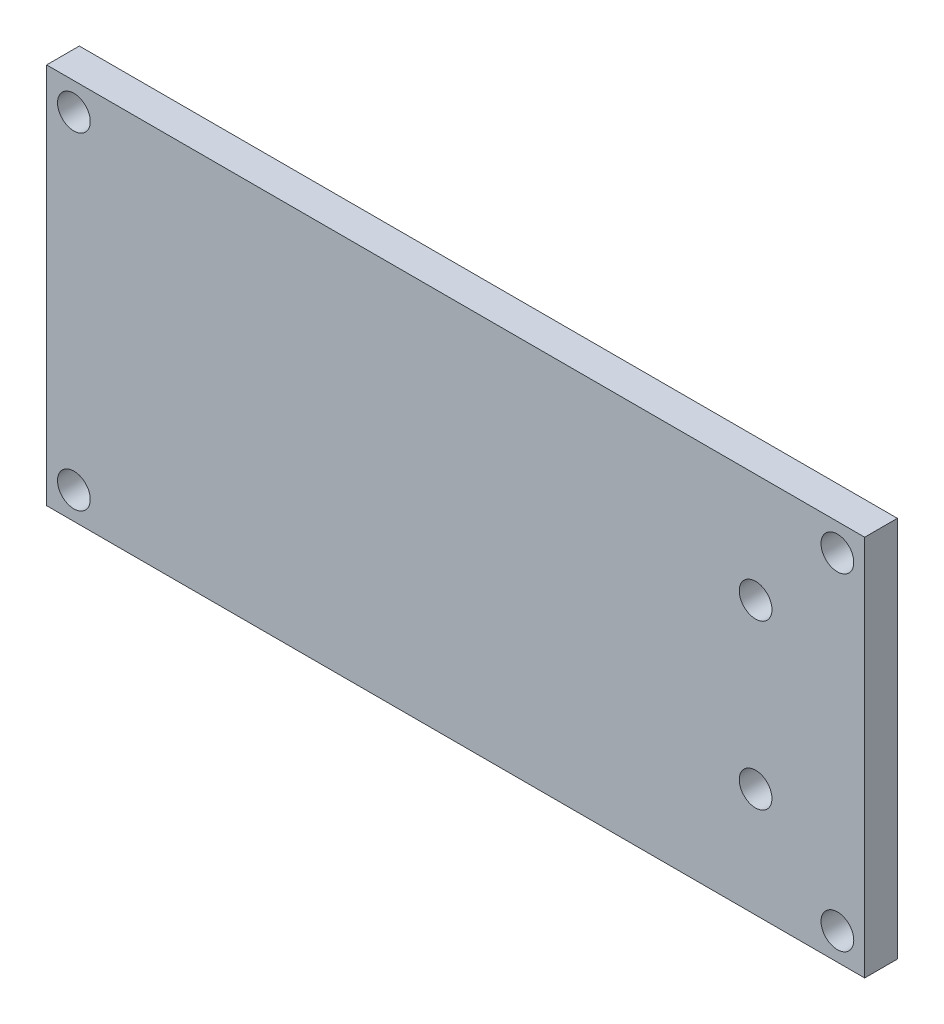
ISO-10303-21;
HEADER;
FILE_DESCRIPTION(('STEP AP214'),'2;1');
FILE_NAME('part.step','',(''),(''),'','','');
FILE_SCHEMA(('AUTOMOTIVE_DESIGN { 1 0 10303 214 1 1 1 1 }'));
ENDSEC;
DATA;
#1=APPLICATION_CONTEXT('core data for automotive mechanical design processes');
#2=APPLICATION_PROTOCOL_DEFINITION('international standard','automotive_design',2000,#1);
#3=PRODUCT_CONTEXT('',#1,'mechanical');
#4=PRODUCT('Part','Part','',(#3));
#5=PRODUCT_RELATED_PRODUCT_CATEGORY('part','',(#4));
#6=PRODUCT_DEFINITION_FORMATION('','',#4);
#7=PRODUCT_DEFINITION_CONTEXT('part definition',#1,'design');
#8=PRODUCT_DEFINITION('design','',#6,#7);
#9=PRODUCT_DEFINITION_SHAPE('','',#8);
#10=(LENGTH_UNIT() NAMED_UNIT(*) SI_UNIT(.MILLI.,.METRE.));
#11=(NAMED_UNIT(*) PLANE_ANGLE_UNIT() SI_UNIT($,.RADIAN.));
#12=(NAMED_UNIT(*) SI_UNIT($,.STERADIAN.) SOLID_ANGLE_UNIT());
#13=UNCERTAINTY_MEASURE_WITH_UNIT(LENGTH_MEASURE(1.E-05),#10,'distance_accuracy_value','');
#14=(GEOMETRIC_REPRESENTATION_CONTEXT(3) GLOBAL_UNCERTAINTY_ASSIGNED_CONTEXT((#13)) GLOBAL_UNIT_ASSIGNED_CONTEXT((#10,
#11,#12)) REPRESENTATION_CONTEXT('',''));
#15=CARTESIAN_POINT('',(0.,0.,0.));
#16=DIRECTION('',(0.,0.,1.));
#17=DIRECTION('',(1.,0.,0.));
#18=AXIS2_PLACEMENT_3D('',#15,#16,#17);
#19=CARTESIAN_POINT('',(0.,0.,3.));
#20=DIRECTION('',(0.,0.,-1.));
#21=DIRECTION('',(-1.,0.,0.));
#22=AXIS2_PLACEMENT_3D('',#19,#20,#21);
#23=PLANE('',#22);
#24=DIRECTION('',(0.,-1.,0.));
#25=VECTOR('',#24,1.);
#26=CARTESIAN_POINT('',(0.,0.,3.));
#27=LINE('',#26,#25);
#28=CARTESIAN_POINT('',(0.,35.,3.));
#29=VERTEX_POINT('',#28);
#30=CARTESIAN_POINT('',(0.,0.,3.));
#31=VERTEX_POINT('',#30);
#32=EDGE_CURVE('E98',#29,#31,#27,.T.);
#33=ORIENTED_EDGE('',*,*,#32,.T.);
#34=DIRECTION('',(1.,0.,0.));
#35=VECTOR('',#34,1.);
#36=CARTESIAN_POINT('',(0.,0.,3.));
#37=LINE('',#36,#35);
#38=CARTESIAN_POINT('',(75.,0.,3.));
#39=VERTEX_POINT('',#38);
#40=EDGE_CURVE('E93',#31,#39,#37,.T.);
#41=ORIENTED_EDGE('',*,*,#40,.T.);
#42=DIRECTION('',(0.,1.,0.));
#43=VECTOR('',#42,1.);
#44=CARTESIAN_POINT('',(75.,0.,3.));
#45=LINE('',#44,#43);
#46=CARTESIAN_POINT('',(75.,35.,3.));
#47=VERTEX_POINT('',#46);
#48=EDGE_CURVE('E96',#39,#47,#45,.T.);
#49=ORIENTED_EDGE('',*,*,#48,.T.);
#50=DIRECTION('',(-1.,0.,0.));
#51=VECTOR('',#50,1.);
#52=CARTESIAN_POINT('',(0.,35.,3.));
#53=LINE('',#52,#51);
#54=EDGE_CURVE('E63',#47,#29,#53,.T.);
#55=ORIENTED_EDGE('',*,*,#54,.T.);
#56=EDGE_LOOP('',(#33,#41,#49,#55));
#57=FACE_BOUND('',#56,.T.);
#58=CARTESIAN_POINT('',(2.5,32.5,3.));
#59=DIRECTION('',(0.,0.,1.));
#60=DIRECTION('',(1.,0.,0.));
#61=AXIS2_PLACEMENT_3D('',#58,#59,#60);
#62=CIRCLE('',#61,1.5);
#63=CARTESIAN_POINT('',(4.,32.5,3.));
#64=VERTEX_POINT('',#63);
#65=EDGE_CURVE('E118',#64,#64,#62,.T.);
#66=ORIENTED_EDGE('',*,*,#65,.F.);
#67=EDGE_LOOP('',(#66));
#68=FACE_BOUND('',#67,.T.);
#69=CARTESIAN_POINT('',(2.5,2.5,3.));
#70=DIRECTION('',(0.,0.,1.));
#71=DIRECTION('',(1.,0.,0.));
#72=AXIS2_PLACEMENT_3D('',#69,#70,#71);
#73=CIRCLE('',#72,1.5);
#74=CARTESIAN_POINT('',(4.,2.5,3.));
#75=VERTEX_POINT('',#74);
#76=EDGE_CURVE('E140',#75,#75,#73,.T.);
#77=ORIENTED_EDGE('',*,*,#76,.F.);
#78=EDGE_LOOP('',(#77));
#79=FACE_BOUND('',#78,.T.);
#80=CARTESIAN_POINT('',(72.5,2.5,3.));
#81=DIRECTION('',(0.,0.,1.));
#82=DIRECTION('',(1.,0.,0.));
#83=AXIS2_PLACEMENT_3D('',#80,#81,#82);
#84=CIRCLE('',#83,1.5);
#85=CARTESIAN_POINT('',(74.,2.5,3.));
#86=VERTEX_POINT('',#85);
#87=EDGE_CURVE('E148',#86,#86,#84,.T.);
#88=ORIENTED_EDGE('',*,*,#87,.F.);
#89=EDGE_LOOP('',(#88));
#90=FACE_BOUND('',#89,.T.);
#91=CARTESIAN_POINT('',(72.5,32.5,3.));
#92=DIRECTION('',(0.,0.,1.));
#93=DIRECTION('',(1.,0.,0.));
#94=AXIS2_PLACEMENT_3D('',#91,#92,#93);
#95=CIRCLE('',#94,1.5);
#96=CARTESIAN_POINT('',(74.,32.5,3.));
#97=VERTEX_POINT('',#96);
#98=EDGE_CURVE('E156',#97,#97,#95,.T.);
#99=ORIENTED_EDGE('',*,*,#98,.F.);
#100=EDGE_LOOP('',(#99));
#101=FACE_BOUND('',#100,.T.);
#102=CARTESIAN_POINT('',(65.,10.,3.));
#103=DIRECTION('',(0.,0.,1.));
#104=DIRECTION('',(1.,0.,0.));
#105=AXIS2_PLACEMENT_3D('',#102,#103,#104);
#106=CIRCLE('',#105,1.5);
#107=CARTESIAN_POINT('',(66.5,10.,3.));
#108=VERTEX_POINT('',#107);
#109=EDGE_CURVE('E164',#108,#108,#106,.T.);
#110=ORIENTED_EDGE('',*,*,#109,.F.);
#111=EDGE_LOOP('',(#110));
#112=FACE_BOUND('',#111,.T.);
#113=CARTESIAN_POINT('',(65.,25.,3.));
#114=DIRECTION('',(0.,0.,1.));
#115=DIRECTION('',(1.,0.,0.));
#116=AXIS2_PLACEMENT_3D('',#113,#114,#115);
#117=CIRCLE('',#116,1.5);
#118=CARTESIAN_POINT('',(66.5,25.,3.));
#119=VERTEX_POINT('',#118);
#120=EDGE_CURVE('E172',#119,#119,#117,.T.);
#121=ORIENTED_EDGE('',*,*,#120,.F.);
#122=EDGE_LOOP('',(#121));
#123=FACE_BOUND('',#122,.T.);
#124=ADVANCED_FACE('F45',(#57,#68,#79,#90,#101,#112,#123),#23,.F.);
#125=CARTESIAN_POINT('',(0.,0.,0.));
#126=DIRECTION('',(0.,0.,-1.));
#127=DIRECTION('',(-1.,0.,0.));
#128=AXIS2_PLACEMENT_3D('',#125,#126,#127);
#129=PLANE('',#128);
#130=CARTESIAN_POINT('',(65.,10.,0.));
#131=DIRECTION('',(0.,0.,1.));
#132=DIRECTION('',(1.,0.,0.));
#133=AXIS2_PLACEMENT_3D('',#130,#131,#132);
#134=CIRCLE('',#133,1.5);
#135=CARTESIAN_POINT('',(66.5,10.,0.));
#136=VERTEX_POINT('',#135);
#137=EDGE_CURVE('E168',#136,#136,#134,.T.);
#138=ORIENTED_EDGE('',*,*,#137,.T.);
#139=EDGE_LOOP('',(#138));
#140=FACE_BOUND('',#139,.T.);
#141=CARTESIAN_POINT('',(72.5,2.5,0.));
#142=DIRECTION('',(0.,0.,1.));
#143=DIRECTION('',(1.,0.,0.));
#144=AXIS2_PLACEMENT_3D('',#141,#142,#143);
#145=CIRCLE('',#144,1.5);
#146=CARTESIAN_POINT('',(74.,2.5,0.));
#147=VERTEX_POINT('',#146);
#148=EDGE_CURVE('E152',#147,#147,#145,.T.);
#149=ORIENTED_EDGE('',*,*,#148,.T.);
#150=EDGE_LOOP('',(#149));
#151=FACE_BOUND('',#150,.T.);
#152=CARTESIAN_POINT('',(2.5,32.5,0.));
#153=DIRECTION('',(0.,0.,1.));
#154=DIRECTION('',(1.,0.,0.));
#155=AXIS2_PLACEMENT_3D('',#152,#153,#154);
#156=CIRCLE('',#155,1.5);
#157=CARTESIAN_POINT('',(4.,32.5,0.));
#158=VERTEX_POINT('',#157);
#159=EDGE_CURVE('E136',#158,#158,#156,.T.);
#160=ORIENTED_EDGE('',*,*,#159,.T.);
#161=EDGE_LOOP('',(#160));
#162=FACE_BOUND('',#161,.T.);
#163=DIRECTION('',(0.,-1.,0.));
#164=VECTOR('',#163,1.);
#165=CARTESIAN_POINT('',(0.,0.,0.));
#166=LINE('',#165,#164);
#167=CARTESIAN_POINT('',(0.,35.,0.));
#168=VERTEX_POINT('',#167);
#169=CARTESIAN_POINT('',(0.,0.,0.));
#170=VERTEX_POINT('',#169);
#171=EDGE_CURVE('E114',#168,#170,#166,.T.);
#172=ORIENTED_EDGE('',*,*,#171,.F.);
#173=DIRECTION('',(-1.,0.,0.));
#174=VECTOR('',#173,1.);
#175=CARTESIAN_POINT('',(0.,35.,0.));
#176=LINE('',#175,#174);
#177=CARTESIAN_POINT('',(75.,35.,0.));
#178=VERTEX_POINT('',#177);
#179=EDGE_CURVE('E86',#178,#168,#176,.T.);
#180=ORIENTED_EDGE('',*,*,#179,.F.);
#181=DIRECTION('',(0.,1.,0.));
#182=VECTOR('',#181,1.);
#183=CARTESIAN_POINT('',(75.,0.,0.));
#184=LINE('',#183,#182);
#185=CARTESIAN_POINT('',(75.,0.,0.));
#186=VERTEX_POINT('',#185);
#187=EDGE_CURVE('E80',#186,#178,#184,.T.);
#188=ORIENTED_EDGE('',*,*,#187,.F.);
#189=DIRECTION('',(1.,0.,0.));
#190=VECTOR('',#189,1.);
#191=CARTESIAN_POINT('',(0.,0.,0.));
#192=LINE('',#191,#190);
#193=EDGE_CURVE('E103',#170,#186,#192,.T.);
#194=ORIENTED_EDGE('',*,*,#193,.F.);
#195=EDGE_LOOP('',(#172,#180,#188,#194));
#196=FACE_BOUND('',#195,.T.);
#197=CARTESIAN_POINT('',(2.5,2.5,0.));
#198=DIRECTION('',(0.,0.,1.));
#199=DIRECTION('',(1.,0.,0.));
#200=AXIS2_PLACEMENT_3D('',#197,#198,#199);
#201=CIRCLE('',#200,1.5);
#202=CARTESIAN_POINT('',(4.,2.5,0.));
#203=VERTEX_POINT('',#202);
#204=EDGE_CURVE('E144',#203,#203,#201,.T.);
#205=ORIENTED_EDGE('',*,*,#204,.T.);
#206=EDGE_LOOP('',(#205));
#207=FACE_BOUND('',#206,.T.);
#208=CARTESIAN_POINT('',(72.5,32.5,0.));
#209=DIRECTION('',(0.,0.,1.));
#210=DIRECTION('',(1.,0.,0.));
#211=AXIS2_PLACEMENT_3D('',#208,#209,#210);
#212=CIRCLE('',#211,1.5);
#213=CARTESIAN_POINT('',(74.,32.5,0.));
#214=VERTEX_POINT('',#213);
#215=EDGE_CURVE('E160',#214,#214,#212,.T.);
#216=ORIENTED_EDGE('',*,*,#215,.T.);
#217=EDGE_LOOP('',(#216));
#218=FACE_BOUND('',#217,.T.);
#219=CARTESIAN_POINT('',(65.,25.,0.));
#220=DIRECTION('',(0.,0.,1.));
#221=DIRECTION('',(1.,0.,0.));
#222=AXIS2_PLACEMENT_3D('',#219,#220,#221);
#223=CIRCLE('',#222,1.5);
#224=CARTESIAN_POINT('',(66.5,25.,0.));
#225=VERTEX_POINT('',#224);
#226=EDGE_CURVE('E176',#225,#225,#223,.T.);
#227=ORIENTED_EDGE('',*,*,#226,.T.);
#228=EDGE_LOOP('',(#227));
#229=FACE_BOUND('',#228,.T.);
#230=ADVANCED_FACE('F131',(#140,#151,#162,#196,#207,#218,#229),#129,.T.);
#231=CARTESIAN_POINT('',(0.,0.,3.));
#232=DIRECTION('',(1.,0.,0.));
#233=DIRECTION('',(0.,0.,-1.));
#234=AXIS2_PLACEMENT_3D('',#231,#232,#233);
#235=PLANE('',#234);
#236=ORIENTED_EDGE('',*,*,#171,.T.);
#237=DIRECTION('',(0.,0.,-1.));
#238=VECTOR('',#237,1.);
#239=CARTESIAN_POINT('',(0.,0.,3.));
#240=LINE('',#239,#238);
#241=EDGE_CURVE('E11',#31,#170,#240,.T.);
#242=ORIENTED_EDGE('',*,*,#241,.F.);
#243=ORIENTED_EDGE('',*,*,#32,.F.);
#244=DIRECTION('',(0.,0.,-1.));
#245=VECTOR('',#244,1.);
#246=CARTESIAN_POINT('',(0.,35.,3.));
#247=LINE('',#246,#245);
#248=EDGE_CURVE('E110',#29,#168,#247,.T.);
#249=ORIENTED_EDGE('',*,*,#248,.T.);
#250=EDGE_LOOP('',(#236,#242,#243,#249));
#251=FACE_BOUND('',#250,.T.);
#252=ADVANCED_FACE('F47',(#251),#235,.F.);
#253=CARTESIAN_POINT('',(0.,0.,3.));
#254=DIRECTION('',(0.,1.,0.));
#255=DIRECTION('',(0.,0.,1.));
#256=AXIS2_PLACEMENT_3D('',#253,#254,#255);
#257=PLANE('',#256);
#258=ORIENTED_EDGE('',*,*,#193,.T.);
#259=DIRECTION('',(0.,0.,-1.));
#260=VECTOR('',#259,1.);
#261=CARTESIAN_POINT('',(75.,0.,3.));
#262=LINE('',#261,#260);
#263=EDGE_CURVE('E55',#39,#186,#262,.T.);
#264=ORIENTED_EDGE('',*,*,#263,.F.);
#265=ORIENTED_EDGE('',*,*,#40,.F.);
#266=ORIENTED_EDGE('',*,*,#241,.T.);
#267=EDGE_LOOP('',(#258,#264,#265,#266));
#268=FACE_BOUND('',#267,.T.);
#269=ADVANCED_FACE('F102',(#268),#257,.F.);
#270=CARTESIAN_POINT('',(75.,0.,3.));
#271=DIRECTION('',(-1.,0.,0.));
#272=DIRECTION('',(0.,0.,1.));
#273=AXIS2_PLACEMENT_3D('',#270,#271,#272);
#274=PLANE('',#273);
#275=ORIENTED_EDGE('',*,*,#187,.T.);
#276=DIRECTION('',(0.,0.,-1.));
#277=VECTOR('',#276,1.);
#278=CARTESIAN_POINT('',(75.,35.,3.));
#279=LINE('',#278,#277);
#280=EDGE_CURVE('E105',#47,#178,#279,.T.);
#281=ORIENTED_EDGE('',*,*,#280,.F.);
#282=ORIENTED_EDGE('',*,*,#48,.F.);
#283=ORIENTED_EDGE('',*,*,#263,.T.);
#284=EDGE_LOOP('',(#275,#281,#282,#283));
#285=FACE_BOUND('',#284,.T.);
#286=ADVANCED_FACE('F106',(#285),#274,.F.);
#287=CARTESIAN_POINT('',(0.,35.,3.));
#288=DIRECTION('',(0.,-1.,0.));
#289=DIRECTION('',(0.,0.,-1.));
#290=AXIS2_PLACEMENT_3D('',#287,#288,#289);
#291=PLANE('',#290);
#292=ORIENTED_EDGE('',*,*,#179,.T.);
#293=ORIENTED_EDGE('',*,*,#248,.F.);
#294=ORIENTED_EDGE('',*,*,#54,.F.);
#295=ORIENTED_EDGE('',*,*,#280,.T.);
#296=EDGE_LOOP('',(#292,#293,#294,#295));
#297=FACE_BOUND('',#296,.T.);
#298=ADVANCED_FACE('F128',(#297),#291,.F.);
#299=CARTESIAN_POINT('',(2.5,32.5,3.));
#300=DIRECTION('',(0.,0.,-1.));
#301=DIRECTION('',(-1.,0.,0.));
#302=AXIS2_PLACEMENT_3D('',#299,#300,#301);
#303=CYLINDRICAL_SURFACE('',#302,1.5);
#304=ORIENTED_EDGE('',*,*,#65,.T.);
#305=EDGE_LOOP('',(#304));
#306=FACE_BOUND('',#305,.T.);
#307=ORIENTED_EDGE('',*,*,#159,.F.);
#308=EDGE_LOOP('',(#307));
#309=FACE_BOUND('',#308,.T.);
#310=ADVANCED_FACE('F195',(#306,#309),#303,.F.);
#311=CARTESIAN_POINT('',(2.5,2.5,3.));
#312=DIRECTION('',(0.,0.,-1.));
#313=DIRECTION('',(-1.,0.,0.));
#314=AXIS2_PLACEMENT_3D('',#311,#312,#313);
#315=CYLINDRICAL_SURFACE('',#314,1.5);
#316=ORIENTED_EDGE('',*,*,#76,.T.);
#317=EDGE_LOOP('',(#316));
#318=FACE_BOUND('',#317,.T.);
#319=ORIENTED_EDGE('',*,*,#204,.F.);
#320=EDGE_LOOP('',(#319));
#321=FACE_BOUND('',#320,.T.);
#322=ADVANCED_FACE('F240',(#318,#321),#315,.F.);
#323=CARTESIAN_POINT('',(72.5,2.5,3.));
#324=DIRECTION('',(0.,0.,-1.));
#325=DIRECTION('',(-1.,0.,0.));
#326=AXIS2_PLACEMENT_3D('',#323,#324,#325);
#327=CYLINDRICAL_SURFACE('',#326,1.5);
#328=ORIENTED_EDGE('',*,*,#87,.T.);
#329=EDGE_LOOP('',(#328));
#330=FACE_BOUND('',#329,.T.);
#331=ORIENTED_EDGE('',*,*,#148,.F.);
#332=EDGE_LOOP('',(#331));
#333=FACE_BOUND('',#332,.T.);
#334=ADVANCED_FACE('F248',(#330,#333),#327,.F.);
#335=CARTESIAN_POINT('',(72.5,32.5,3.));
#336=DIRECTION('',(0.,0.,-1.));
#337=DIRECTION('',(-1.,0.,0.));
#338=AXIS2_PLACEMENT_3D('',#335,#336,#337);
#339=CYLINDRICAL_SURFACE('',#338,1.5);
#340=ORIENTED_EDGE('',*,*,#98,.T.);
#341=EDGE_LOOP('',(#340));
#342=FACE_BOUND('',#341,.T.);
#343=ORIENTED_EDGE('',*,*,#215,.F.);
#344=EDGE_LOOP('',(#343));
#345=FACE_BOUND('',#344,.T.);
#346=ADVANCED_FACE('F256',(#342,#345),#339,.F.);
#347=CARTESIAN_POINT('',(65.,10.,3.));
#348=DIRECTION('',(0.,0.,-1.));
#349=DIRECTION('',(-1.,0.,0.));
#350=AXIS2_PLACEMENT_3D('',#347,#348,#349);
#351=CYLINDRICAL_SURFACE('',#350,1.5);
#352=ORIENTED_EDGE('',*,*,#109,.T.);
#353=EDGE_LOOP('',(#352));
#354=FACE_BOUND('',#353,.T.);
#355=ORIENTED_EDGE('',*,*,#137,.F.);
#356=EDGE_LOOP('',(#355));
#357=FACE_BOUND('',#356,.T.);
#358=ADVANCED_FACE('F265',(#354,#357),#351,.F.);
#359=CARTESIAN_POINT('',(65.,25.,3.));
#360=DIRECTION('',(0.,0.,-1.));
#361=DIRECTION('',(-1.,0.,0.));
#362=AXIS2_PLACEMENT_3D('',#359,#360,#361);
#363=CYLINDRICAL_SURFACE('',#362,1.5);
#364=ORIENTED_EDGE('',*,*,#120,.T.);
#365=EDGE_LOOP('',(#364));
#366=FACE_BOUND('',#365,.T.);
#367=ORIENTED_EDGE('',*,*,#226,.F.);
#368=EDGE_LOOP('',(#367));
#369=FACE_BOUND('',#368,.T.);
#370=ADVANCED_FACE('F184',(#366,#369),#363,.F.);
#371=CLOSED_SHELL('',(#124,#230,#252,#269,#286,#298,#310,#322,#334,#346,#358,#370));
#372=MANIFOLD_SOLID_BREP('B2',#371);
#373=ADVANCED_BREP_SHAPE_REPRESENTATION('',(#18,#372),#14);
#374=SHAPE_DEFINITION_REPRESENTATION(#9,#373);
ENDSEC;
END-ISO-10303-21;
